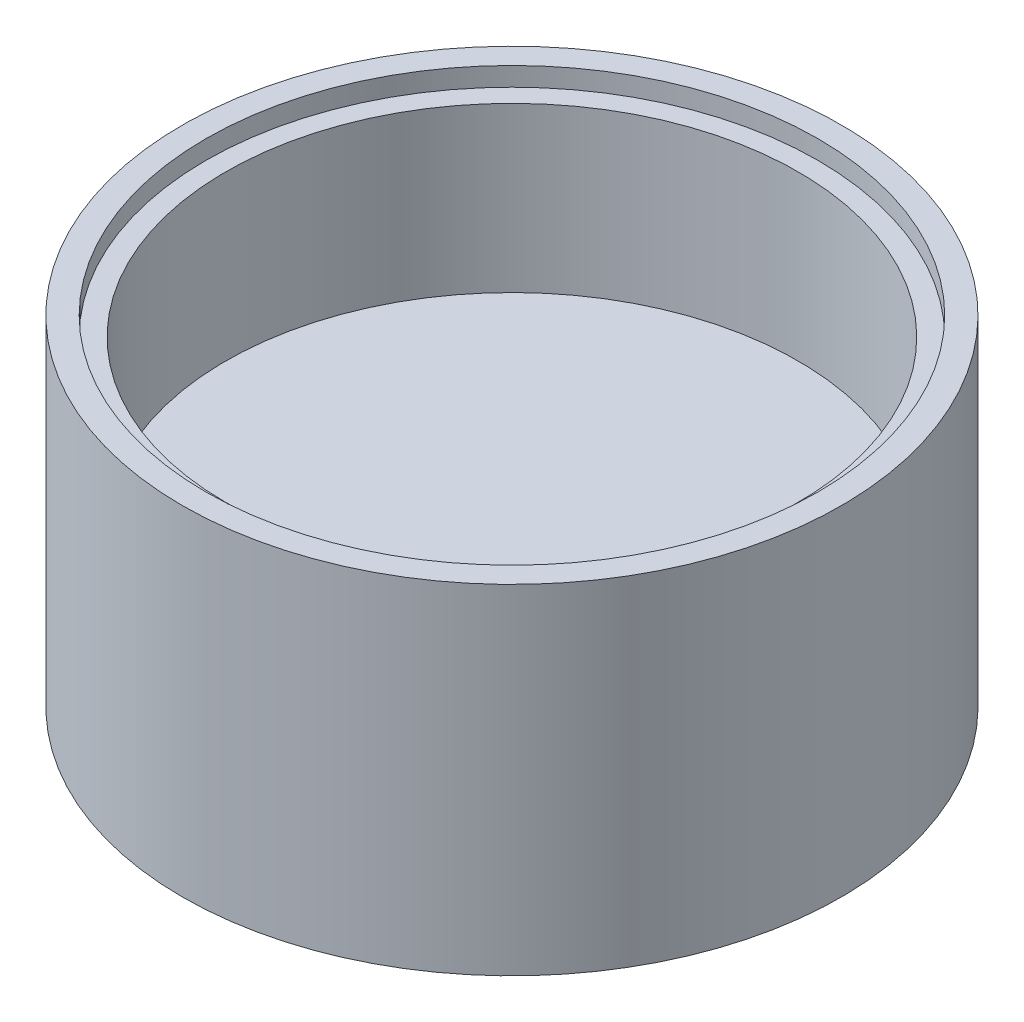
ISO-10303-21;
HEADER;
FILE_DESCRIPTION(('STEP AP214'),'2;1');
FILE_NAME('part.step','',(''),(''),'','','');
FILE_SCHEMA(('AUTOMOTIVE_DESIGN { 1 0 10303 214 1 1 1 1 }'));
ENDSEC;
DATA;
#1=APPLICATION_CONTEXT('core data for automotive mechanical design processes');
#2=APPLICATION_PROTOCOL_DEFINITION('international standard','automotive_design',2000,#1);
#3=PRODUCT_CONTEXT('',#1,'mechanical');
#4=PRODUCT('Part','Part','',(#3));
#5=PRODUCT_RELATED_PRODUCT_CATEGORY('part','',(#4));
#6=PRODUCT_DEFINITION_FORMATION('','',#4);
#7=PRODUCT_DEFINITION_CONTEXT('part definition',#1,'design');
#8=PRODUCT_DEFINITION('design','',#6,#7);
#9=PRODUCT_DEFINITION_SHAPE('','',#8);
#10=(LENGTH_UNIT() NAMED_UNIT(*) SI_UNIT(.MILLI.,.METRE.));
#11=(NAMED_UNIT(*) PLANE_ANGLE_UNIT() SI_UNIT($,.RADIAN.));
#12=(NAMED_UNIT(*) SI_UNIT($,.STERADIAN.) SOLID_ANGLE_UNIT());
#13=UNCERTAINTY_MEASURE_WITH_UNIT(LENGTH_MEASURE(1.E-05),#10,'distance_accuracy_value','');
#14=(GEOMETRIC_REPRESENTATION_CONTEXT(3) GLOBAL_UNCERTAINTY_ASSIGNED_CONTEXT((#13)) GLOBAL_UNIT_ASSIGNED_CONTEXT((#10,
#11,#12)) REPRESENTATION_CONTEXT('',''));
#15=CARTESIAN_POINT('',(0.,0.,0.));
#16=DIRECTION('',(0.,0.,1.));
#17=DIRECTION('',(1.,0.,0.));
#18=AXIS2_PLACEMENT_3D('',#15,#16,#17);
#19=CARTESIAN_POINT('',(0.,18.,0.));
#20=DIRECTION('',(0.,-1.,0.));
#21=DIRECTION('',(0.,0.,-1.));
#22=AXIS2_PLACEMENT_3D('',#19,#20,#21);
#23=CYLINDRICAL_SURFACE('',#22,17.5);
#24=CARTESIAN_POINT('',(0.,18.,0.));
#25=DIRECTION('',(0.,1.,0.));
#26=DIRECTION('',(0.,0.,1.));
#27=AXIS2_PLACEMENT_3D('',#24,#25,#26);
#28=CIRCLE('',#27,17.5);
#29=CARTESIAN_POINT('',(0.,18.,17.5));
#30=VERTEX_POINT('',#29);
#31=EDGE_CURVE('E41',#30,#30,#28,.T.);
#32=ORIENTED_EDGE('',*,*,#31,.F.);
#33=EDGE_LOOP('',(#32));
#34=FACE_BOUND('',#33,.T.);
#35=CARTESIAN_POINT('',(0.,0.,0.));
#36=DIRECTION('',(0.,1.,0.));
#37=DIRECTION('',(0.,0.,1.));
#38=AXIS2_PLACEMENT_3D('',#35,#36,#37);
#39=CIRCLE('',#38,17.5);
#40=CARTESIAN_POINT('',(0.,0.,17.5));
#41=VERTEX_POINT('',#40);
#42=EDGE_CURVE('E45',#41,#41,#39,.T.);
#43=ORIENTED_EDGE('',*,*,#42,.T.);
#44=EDGE_LOOP('',(#43));
#45=FACE_BOUND('',#44,.T.);
#46=ADVANCED_FACE('F35',(#34,#45),#23,.T.);
#47=CARTESIAN_POINT('',(0.,18.,0.));
#48=DIRECTION('',(0.,1.,0.));
#49=DIRECTION('',(0.,0.,1.));
#50=AXIS2_PLACEMENT_3D('',#47,#48,#49);
#51=PLANE('',#50);
#52=CARTESIAN_POINT('',(0.,18.,0.));
#53=DIRECTION('',(0.,1.,0.));
#54=DIRECTION('',(0.,0.,1.));
#55=AXIS2_PLACEMENT_3D('',#52,#53,#54);
#56=CIRCLE('',#55,16.25);
#57=CARTESIAN_POINT('',(0.,18.,16.25));
#58=VERTEX_POINT('',#57);
#59=EDGE_CURVE('E53',#58,#58,#56,.T.);
#60=ORIENTED_EDGE('',*,*,#59,.F.);
#61=EDGE_LOOP('',(#60));
#62=FACE_BOUND('',#61,.T.);
#63=ORIENTED_EDGE('',*,*,#31,.T.);
#64=EDGE_LOOP('',(#63));
#65=FACE_BOUND('',#64,.T.);
#66=ADVANCED_FACE('F67',(#62,#65),#51,.T.);
#67=CARTESIAN_POINT('',(0.,0.,0.));
#68=DIRECTION('',(0.,1.,0.));
#69=DIRECTION('',(0.,0.,1.));
#70=AXIS2_PLACEMENT_3D('',#67,#68,#69);
#71=PLANE('',#70);
#72=ORIENTED_EDGE('',*,*,#42,.F.);
#73=EDGE_LOOP('',(#72));
#74=FACE_BOUND('',#73,.T.);
#75=ADVANCED_FACE('F69',(#74),#71,.F.);
#76=CARTESIAN_POINT('',(0.,17.,0.));
#77=DIRECTION('',(0.,1.,0.));
#78=DIRECTION('',(0.,0.,1.));
#79=AXIS2_PLACEMENT_3D('',#76,#77,#78);
#80=CYLINDRICAL_SURFACE('',#79,16.25);
#81=CARTESIAN_POINT('',(0.,17.,0.));
#82=DIRECTION('',(0.,1.,0.));
#83=DIRECTION('',(0.,0.,1.));
#84=AXIS2_PLACEMENT_3D('',#81,#82,#83);
#85=CIRCLE('',#84,16.25);
#86=CARTESIAN_POINT('',(0.,17.,16.25));
#87=VERTEX_POINT('',#86);
#88=EDGE_CURVE('E56',#87,#87,#85,.T.);
#89=ORIENTED_EDGE('',*,*,#88,.F.);
#90=EDGE_LOOP('',(#89));
#91=FACE_BOUND('',#90,.T.);
#92=ORIENTED_EDGE('',*,*,#59,.T.);
#93=EDGE_LOOP('',(#92));
#94=FACE_BOUND('',#93,.T.);
#95=ADVANCED_FACE('F65',(#91,#94),#80,.F.);
#96=CARTESIAN_POINT('',(0.,17.,0.));
#97=DIRECTION('',(0.,1.,0.));
#98=DIRECTION('',(0.,0.,1.));
#99=AXIS2_PLACEMENT_3D('',#96,#97,#98);
#100=PLANE('',#99);
#101=CARTESIAN_POINT('',(0.,17.,0.));
#102=DIRECTION('',(0.,1.,0.));
#103=DIRECTION('',(0.,0.,1.));
#104=AXIS2_PLACEMENT_3D('',#101,#102,#103);
#105=CIRCLE('',#104,15.2);
#106=CARTESIAN_POINT('',(0.,17.,15.2));
#107=VERTEX_POINT('',#106);
#108=EDGE_CURVE('E50',#107,#107,#105,.T.);
#109=ORIENTED_EDGE('',*,*,#108,.F.);
#110=EDGE_LOOP('',(#109));
#111=FACE_BOUND('',#110,.T.);
#112=ORIENTED_EDGE('',*,*,#88,.T.);
#113=EDGE_LOOP('',(#112));
#114=FACE_BOUND('',#113,.T.);
#115=ADVANCED_FACE('F84',(#111,#114),#100,.T.);
#116=CARTESIAN_POINT('',(0.,18.,0.));
#117=DIRECTION('',(0.,-1.,0.));
#118=DIRECTION('',(0.,0.,-1.));
#119=AXIS2_PLACEMENT_3D('',#116,#117,#118);
#120=CYLINDRICAL_SURFACE('',#119,15.2);
#121=CARTESIAN_POINT('',(0.,8.3,0.));
#122=DIRECTION('',(0.,1.,0.));
#123=DIRECTION('',(0.,0.,1.));
#124=AXIS2_PLACEMENT_3D('',#121,#122,#123);
#125=CIRCLE('',#124,15.2);
#126=CARTESIAN_POINT('',(0.,8.3,15.2));
#127=VERTEX_POINT('',#126);
#128=EDGE_CURVE('E10',#127,#127,#125,.T.);
#129=ORIENTED_EDGE('',*,*,#128,.F.);
#130=EDGE_LOOP('',(#129));
#131=FACE_BOUND('',#130,.T.);
#132=ORIENTED_EDGE('',*,*,#108,.T.);
#133=EDGE_LOOP('',(#132));
#134=FACE_BOUND('',#133,.T.);
#135=ADVANCED_FACE('F80',(#131,#134),#120,.F.);
#136=CARTESIAN_POINT('',(0.,8.3,0.));
#137=DIRECTION('',(0.,1.,0.));
#138=DIRECTION('',(0.,0.,1.));
#139=AXIS2_PLACEMENT_3D('',#136,#137,#138);
#140=PLANE('',#139);
#141=ORIENTED_EDGE('',*,*,#128,.T.);
#142=EDGE_LOOP('',(#141));
#143=FACE_BOUND('',#142,.T.);
#144=ADVANCED_FACE('F83',(#143),#140,.T.);
#145=CLOSED_SHELL('',(#46,#66,#75,#95,#115,#135,#144));
#146=MANIFOLD_SOLID_BREP('B2',#145);
#147=ADVANCED_BREP_SHAPE_REPRESENTATION('',(#18,#146),#14);
#148=SHAPE_DEFINITION_REPRESENTATION(#9,#147);
ENDSEC;
END-ISO-10303-21;
